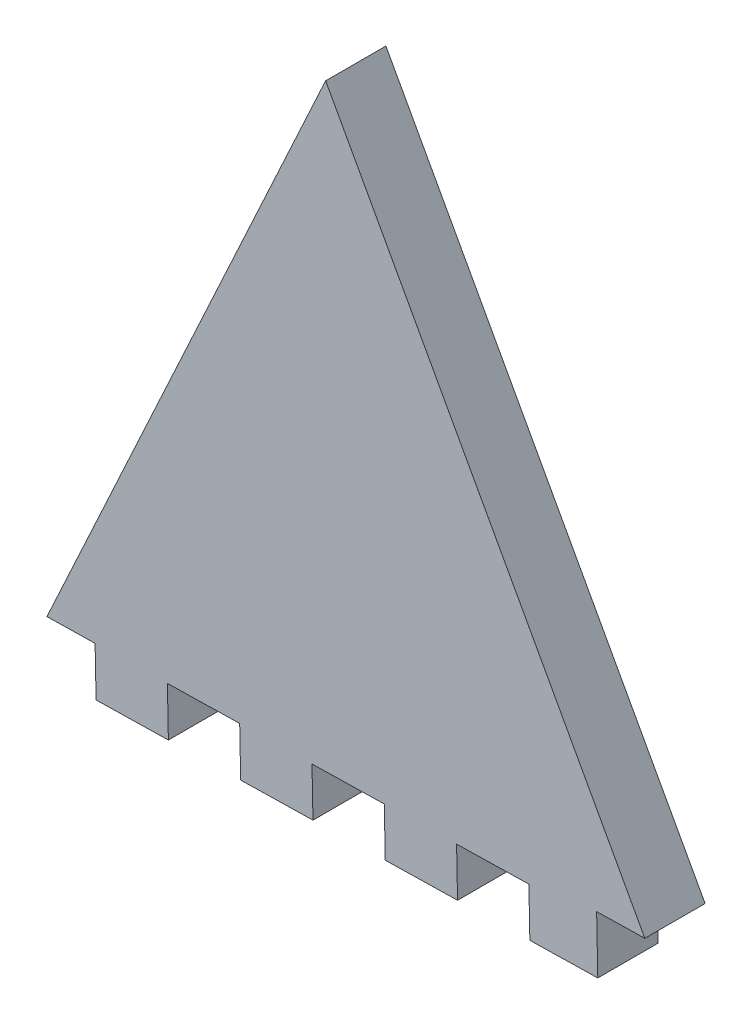
ISO-10303-21;
HEADER;
FILE_DESCRIPTION(('STEP AP214'),'2;1');
FILE_NAME('part.step','',(''),(''),'','','');
FILE_SCHEMA(('AUTOMOTIVE_DESIGN { 1 0 10303 214 1 1 1 1 }'));
ENDSEC;
DATA;
#1=APPLICATION_CONTEXT('core data for automotive mechanical design processes');
#2=APPLICATION_PROTOCOL_DEFINITION('international standard','automotive_design',2000,#1);
#3=PRODUCT_CONTEXT('',#1,'mechanical');
#4=PRODUCT('Part','Part','',(#3));
#5=PRODUCT_RELATED_PRODUCT_CATEGORY('part','',(#4));
#6=PRODUCT_DEFINITION_FORMATION('','',#4);
#7=PRODUCT_DEFINITION_CONTEXT('part definition',#1,'design');
#8=PRODUCT_DEFINITION('design','',#6,#7);
#9=PRODUCT_DEFINITION_SHAPE('','',#8);
#10=(LENGTH_UNIT() NAMED_UNIT(*) SI_UNIT(.MILLI.,.METRE.));
#11=(NAMED_UNIT(*) PLANE_ANGLE_UNIT() SI_UNIT($,.RADIAN.));
#12=(NAMED_UNIT(*) SI_UNIT($,.STERADIAN.) SOLID_ANGLE_UNIT());
#13=UNCERTAINTY_MEASURE_WITH_UNIT(LENGTH_MEASURE(1.E-05),#10,'distance_accuracy_value','');
#14=(GEOMETRIC_REPRESENTATION_CONTEXT(3) GLOBAL_UNCERTAINTY_ASSIGNED_CONTEXT((#13)) GLOBAL_UNIT_ASSIGNED_CONTEXT((#10,
#11,#12)) REPRESENTATION_CONTEXT('',''));
#15=CARTESIAN_POINT('',(0.,0.,0.));
#16=DIRECTION('',(0.,0.,1.));
#17=DIRECTION('',(1.,0.,0.));
#18=AXIS2_PLACEMENT_3D('',#15,#16,#17);
#19=CARTESIAN_POINT('',(-1.65337425308384,34.0261942117512,3.175));
#20=DIRECTION('',(-0.877154082787675,-0.480209032660687,0.));
#21=DIRECTION('',(0.480209032660687,-0.877154082787675,0.));
#22=AXIS2_PLACEMENT_3D('',#19,#20,#21);
#23=PLANE('',#22);
#24=DIRECTION('',(-0.480209032660687,0.877154082787675,0.));
#25=VECTOR('',#24,1.);
#26=CARTESIAN_POINT('',(-1.65337425308384,34.0261942117512,0.));
#27=LINE('',#26,#25);
#28=CARTESIAN_POINT('',(15.1647757924685,3.30601201181382,0.));
#29=VERTEX_POINT('',#28);
#30=CARTESIAN_POINT('',(-1.65337425308384,34.0261942117512,0.));
#31=VERTEX_POINT('',#30);
#32=EDGE_CURVE('E201',#29,#31,#27,.T.);
#33=ORIENTED_EDGE('',*,*,#32,.T.);
#34=DIRECTION('',(0.,0.,-1.));
#35=VECTOR('',#34,1.);
#36=CARTESIAN_POINT('',(-1.65337425308384,34.0261942117512,3.175));
#37=LINE('',#36,#35);
#38=CARTESIAN_POINT('',(-1.65337425308384,34.0261942117512,3.175));
#39=VERTEX_POINT('',#38);
#40=EDGE_CURVE('E11',#39,#31,#37,.T.);
#41=ORIENTED_EDGE('',*,*,#40,.F.);
#42=DIRECTION('',(-0.480209032660687,0.877154082787675,0.));
#43=VECTOR('',#42,1.);
#44=CARTESIAN_POINT('',(-1.65337425308384,34.0261942117512,3.175));
#45=LINE('',#44,#43);
#46=CARTESIAN_POINT('',(15.1647757924685,3.30601201181382,3.175));
#47=VERTEX_POINT('',#46);
#48=EDGE_CURVE('E237',#47,#39,#45,.T.);
#49=ORIENTED_EDGE('',*,*,#48,.F.);
#50=DIRECTION('',(0.,0.,-1.));
#51=VECTOR('',#50,1.);
#52=CARTESIAN_POINT('',(15.1647757924685,3.30601201181382,3.175));
#53=LINE('',#52,#51);
#54=EDGE_CURVE('E197',#47,#29,#53,.T.);
#55=ORIENTED_EDGE('',*,*,#54,.T.);
#56=EDGE_LOOP('',(#33,#41,#49,#55));
#57=FACE_BOUND('',#56,.T.);
#58=ADVANCED_FACE('F39',(#57),#23,.F.);
#59=CARTESIAN_POINT('',(-16.3405796230757,2.23207897368011,3.175));
#60=DIRECTION('',(0.907818118010795,-0.419364119365662,0.));
#61=DIRECTION('',(0.419364119365663,0.907818118010795,0.));
#62=AXIS2_PLACEMENT_3D('',#59,#60,#61);
#63=PLANE('',#62);
#64=DIRECTION('',(-0.419364119365663,-0.907818118010795,0.));
#65=VECTOR('',#64,1.);
#66=CARTESIAN_POINT('',(-16.3405796230757,2.23207897368011,0.));
#67=LINE('',#66,#65);
#68=CARTESIAN_POINT('',(-16.3405796230757,2.23207897368011,0.));
#69=VERTEX_POINT('',#68);
#70=EDGE_CURVE('E204',#31,#69,#67,.T.);
#71=ORIENTED_EDGE('',*,*,#70,.T.);
#72=DIRECTION('',(0.,0.,-1.));
#73=VECTOR('',#72,1.);
#74=CARTESIAN_POINT('',(-16.3405796230757,2.23207897368011,3.175));
#75=LINE('',#74,#73);
#76=CARTESIAN_POINT('',(-16.3405796230757,2.23207897368011,3.175));
#77=VERTEX_POINT('',#76);
#78=EDGE_CURVE('E47',#77,#69,#75,.T.);
#79=ORIENTED_EDGE('',*,*,#78,.F.);
#80=DIRECTION('',(-0.419364119365663,-0.907818118010795,0.));
#81=VECTOR('',#80,1.);
#82=CARTESIAN_POINT('',(-16.3405796230757,2.23207897368011,3.175));
#83=LINE('',#82,#81);
#84=EDGE_CURVE('E131',#39,#77,#83,.T.);
#85=ORIENTED_EDGE('',*,*,#84,.F.);
#86=ORIENTED_EDGE('',*,*,#40,.T.);
#87=EDGE_LOOP('',(#71,#79,#85,#86));
#88=FACE_BOUND('',#87,.T.);
#89=ADVANCED_FACE('F350',(#88),#63,.F.);
#90=CARTESIAN_POINT('',(-16.3405796230757,2.23207897368011,3.175));
#91=DIRECTION('',(-0.0201197654820474,0.999797577030945,0.));
#92=DIRECTION('',(-0.999797577030945,-0.0201197654820474,0.));
#93=AXIS2_PLACEMENT_3D('',#90,#91,#92);
#94=PLANE('',#93);
#95=DIRECTION('',(0.999797577030945,0.0201197654820474,0.));
#96=VECTOR('',#95,1.);
#97=CARTESIAN_POINT('',(-16.3405796230757,2.23207897368011,0.));
#98=LINE('',#97,#96);
#99=CARTESIAN_POINT('',(-13.8010937774171,2.28318317800451,0.));
#100=VERTEX_POINT('',#99);
#101=EDGE_CURVE('E206',#69,#100,#98,.T.);
#102=ORIENTED_EDGE('',*,*,#101,.T.);
#103=DIRECTION('',(0.,0.,-1.));
#104=VECTOR('',#103,1.);
#105=CARTESIAN_POINT('',(-13.8010937774171,2.28318317800451,3.175));
#106=LINE('',#105,#104);
#107=CARTESIAN_POINT('',(-13.8010937774171,2.28318317800451,3.175));
#108=VERTEX_POINT('',#107);
#109=EDGE_CURVE('E277',#108,#100,#106,.T.);
#110=ORIENTED_EDGE('',*,*,#109,.F.);
#111=DIRECTION('',(0.999797577030945,0.0201197654820474,0.));
#112=VECTOR('',#111,1.);
#113=CARTESIAN_POINT('',(-16.3405796230757,2.23207897368011,3.175));
#114=LINE('',#113,#112);
#115=EDGE_CURVE('E285',#77,#108,#114,.T.);
#116=ORIENTED_EDGE('',*,*,#115,.F.);
#117=ORIENTED_EDGE('',*,*,#78,.T.);
#118=EDGE_LOOP('',(#102,#110,#116,#117));
#119=FACE_BOUND('',#118,.T.);
#120=ADVANCED_FACE('F283',(#119),#94,.F.);
#121=CARTESIAN_POINT('',(-13.8010937774171,2.28318317800451,3.175));
#122=DIRECTION('',(0.999797577030945,0.0201197654820469,0.));
#123=DIRECTION('',(-0.0201197654820469,0.999797577030945,0.));
#124=AXIS2_PLACEMENT_3D('',#121,#122,#123);
#125=PLANE('',#124);
#126=DIRECTION('',(0.0201197654820469,-0.999797577030945,0.));
#127=VECTOR('',#126,1.);
#128=CARTESIAN_POINT('',(-13.8010937774171,2.28318317800451,0.));
#129=LINE('',#128,#127);
#130=CARTESIAN_POINT('',(-13.7495792147927,-0.27669431856394,0.));
#131=VERTEX_POINT('',#130);
#132=EDGE_CURVE('E208',#100,#131,#129,.T.);
#133=ORIENTED_EDGE('',*,*,#132,.T.);
#134=DIRECTION('',(0.,0.,-1.));
#135=VECTOR('',#134,1.);
#136=CARTESIAN_POINT('',(-13.7495792147927,-0.27669431856394,3.175));
#137=LINE('',#136,#135);
#138=CARTESIAN_POINT('',(-13.7495792147927,-0.27669431856394,3.175));
#139=VERTEX_POINT('',#138);
#140=EDGE_CURVE('E274',#139,#131,#137,.T.);
#141=ORIENTED_EDGE('',*,*,#140,.F.);
#142=DIRECTION('',(0.0201197654820469,-0.999797577030945,0.));
#143=VECTOR('',#142,1.);
#144=CARTESIAN_POINT('',(-13.8010937774171,2.28318317800451,3.175));
#145=LINE('',#144,#143);
#146=EDGE_CURVE('E303',#108,#139,#145,.T.);
#147=ORIENTED_EDGE('',*,*,#146,.F.);
#148=ORIENTED_EDGE('',*,*,#109,.T.);
#149=EDGE_LOOP('',(#133,#141,#147,#148));
#150=FACE_BOUND('',#149,.T.);
#151=ADVANCED_FACE('F294',(#150),#125,.F.);
#152=CARTESIAN_POINT('',(-13.7495792147927,-0.27669431856394,3.175));
#153=DIRECTION('',(-0.0201197654820469,0.999797577030945,0.));
#154=DIRECTION('',(-0.999797577030945,-0.0201197654820469,0.));
#155=AXIS2_PLACEMENT_3D('',#152,#153,#154);
#156=PLANE('',#155);
#157=DIRECTION('',(0.999797577030945,0.0201197654820469,0.));
#158=VECTOR('',#157,1.);
#159=CARTESIAN_POINT('',(-13.7495792147927,-0.27669431856394,0.));
#160=LINE('',#159,#158);
#161=CARTESIAN_POINT('',(-9.94035044630479,-0.200038012077341,0.));
#162=VERTEX_POINT('',#161);
#163=EDGE_CURVE('E210',#131,#162,#160,.T.);
#164=ORIENTED_EDGE('',*,*,#163,.T.);
#165=DIRECTION('',(0.,0.,-1.));
#166=VECTOR('',#165,1.);
#167=CARTESIAN_POINT('',(-9.94035044630479,-0.200038012077341,3.175));
#168=LINE('',#167,#166);
#169=CARTESIAN_POINT('',(-9.94035044630479,-0.200038012077341,3.175));
#170=VERTEX_POINT('',#169);
#171=EDGE_CURVE('E271',#170,#162,#168,.T.);
#172=ORIENTED_EDGE('',*,*,#171,.F.);
#173=DIRECTION('',(0.999797577030945,0.0201197654820469,0.));
#174=VECTOR('',#173,1.);
#175=CARTESIAN_POINT('',(-13.7495792147927,-0.27669431856394,3.175));
#176=LINE('',#175,#174);
#177=EDGE_CURVE('E300',#139,#170,#176,.T.);
#178=ORIENTED_EDGE('',*,*,#177,.F.);
#179=ORIENTED_EDGE('',*,*,#140,.T.);
#180=EDGE_LOOP('',(#164,#172,#178,#179));
#181=FACE_BOUND('',#180,.T.);
#182=ADVANCED_FACE('F298',(#181),#156,.F.);
#183=CARTESIAN_POINT('',(-9.94035044630479,-0.200038012077341,3.175));
#184=DIRECTION('',(-0.999797577030945,-0.0201197654820476,0.));
#185=DIRECTION('',(0.0201197654820476,-0.999797577030945,0.));
#186=AXIS2_PLACEMENT_3D('',#183,#184,#185);
#187=PLANE('',#186);
#188=DIRECTION('',(-0.0201197654820476,0.999797577030945,0.));
#189=VECTOR('',#188,1.);
#190=CARTESIAN_POINT('',(-9.94035044630479,-0.200038012077341,0.));
#191=LINE('',#190,#189);
#192=CARTESIAN_POINT('',(-9.99186500892923,2.3598394844911,0.));
#193=VERTEX_POINT('',#192);
#194=EDGE_CURVE('E212',#162,#193,#191,.T.);
#195=ORIENTED_EDGE('',*,*,#194,.T.);
#196=DIRECTION('',(0.,0.,-1.));
#197=VECTOR('',#196,1.);
#198=CARTESIAN_POINT('',(-9.99186500892923,2.3598394844911,3.175));
#199=LINE('',#198,#197);
#200=CARTESIAN_POINT('',(-9.99186500892923,2.3598394844911,3.175));
#201=VERTEX_POINT('',#200);
#202=EDGE_CURVE('E268',#201,#193,#199,.T.);
#203=ORIENTED_EDGE('',*,*,#202,.F.);
#204=DIRECTION('',(-0.0201197654820476,0.999797577030945,0.));
#205=VECTOR('',#204,1.);
#206=CARTESIAN_POINT('',(-9.94035044630479,-0.200038012077341,3.175));
#207=LINE('',#206,#205);
#208=EDGE_CURVE('E302',#170,#201,#207,.T.);
#209=ORIENTED_EDGE('',*,*,#208,.F.);
#210=ORIENTED_EDGE('',*,*,#171,.T.);
#211=EDGE_LOOP('',(#195,#203,#209,#210));
#212=FACE_BOUND('',#211,.T.);
#213=ADVANCED_FACE('F363',(#212),#187,.F.);
#214=CARTESIAN_POINT('',(-9.99186500892923,2.3598394844911,3.175));
#215=DIRECTION('',(-0.020119765482047,0.999797577030945,0.));
#216=DIRECTION('',(-0.999797577030945,-0.020119765482047,0.));
#217=AXIS2_PLACEMENT_3D('',#214,#215,#216);
#218=PLANE('',#217);
#219=DIRECTION('',(0.999797577030945,0.020119765482047,0.));
#220=VECTOR('',#219,1.);
#221=CARTESIAN_POINT('',(-9.99186500892923,2.3598394844911,0.));
#222=LINE('',#221,#220);
#223=CARTESIAN_POINT('',(-6.18263624044133,2.4364957909777,0.));
#224=VERTEX_POINT('',#223);
#225=EDGE_CURVE('E214',#193,#224,#222,.T.);
#226=ORIENTED_EDGE('',*,*,#225,.T.);
#227=DIRECTION('',(0.,0.,-1.));
#228=VECTOR('',#227,1.);
#229=CARTESIAN_POINT('',(-6.18263624044133,2.4364957909777,3.175));
#230=LINE('',#229,#228);
#231=CARTESIAN_POINT('',(-6.18263624044133,2.4364957909777,3.175));
#232=VERTEX_POINT('',#231);
#233=EDGE_CURVE('E265',#232,#224,#230,.T.);
#234=ORIENTED_EDGE('',*,*,#233,.F.);
#235=DIRECTION('',(0.999797577030945,0.020119765482047,0.));
#236=VECTOR('',#235,1.);
#237=CARTESIAN_POINT('',(-9.99186500892923,2.3598394844911,3.175));
#238=LINE('',#237,#236);
#239=EDGE_CURVE('E305',#201,#232,#238,.T.);
#240=ORIENTED_EDGE('',*,*,#239,.F.);
#241=ORIENTED_EDGE('',*,*,#202,.T.);
#242=EDGE_LOOP('',(#226,#234,#240,#241));
#243=FACE_BOUND('',#242,.T.);
#244=ADVANCED_FACE('F366',(#243),#218,.F.);
#245=CARTESIAN_POINT('',(-6.18263624044133,2.4364957909777,3.175));
#246=DIRECTION('',(0.999797577030945,0.0201197654820472,0.));
#247=DIRECTION('',(-0.0201197654820472,0.999797577030945,0.));
#248=AXIS2_PLACEMENT_3D('',#245,#246,#247);
#249=PLANE('',#248);
#250=DIRECTION('',(0.0201197654820472,-0.999797577030945,0.));
#251=VECTOR('',#250,1.);
#252=CARTESIAN_POINT('',(-6.18263624044133,2.4364957909777,0.));
#253=LINE('',#252,#251);
#254=CARTESIAN_POINT('',(-6.13112167781689,-0.123381705590757,0.));
#255=VERTEX_POINT('',#254);
#256=EDGE_CURVE('E216',#224,#255,#253,.T.);
#257=ORIENTED_EDGE('',*,*,#256,.T.);
#258=DIRECTION('',(0.,0.,-1.));
#259=VECTOR('',#258,1.);
#260=CARTESIAN_POINT('',(-6.13112167781689,-0.123381705590757,3.175));
#261=LINE('',#260,#259);
#262=CARTESIAN_POINT('',(-6.13112167781689,-0.123381705590757,3.175));
#263=VERTEX_POINT('',#262);
#264=EDGE_CURVE('E262',#263,#255,#261,.T.);
#265=ORIENTED_EDGE('',*,*,#264,.F.);
#266=DIRECTION('',(0.0201197654820472,-0.999797577030945,0.));
#267=VECTOR('',#266,1.);
#268=CARTESIAN_POINT('',(-6.18263624044133,2.4364957909777,3.175));
#269=LINE('',#268,#267);
#270=EDGE_CURVE('E311',#232,#263,#269,.T.);
#271=ORIENTED_EDGE('',*,*,#270,.F.);
#272=ORIENTED_EDGE('',*,*,#233,.T.);
#273=EDGE_LOOP('',(#257,#265,#271,#272));
#274=FACE_BOUND('',#273,.T.);
#275=ADVANCED_FACE('F370',(#274),#249,.F.);
#276=CARTESIAN_POINT('',(-6.13112167781689,-0.123381705590757,3.175));
#277=DIRECTION('',(-0.0201197654820468,0.999797577030945,0.));
#278=DIRECTION('',(-0.999797577030945,-0.0201197654820468,0.));
#279=AXIS2_PLACEMENT_3D('',#276,#277,#278);
#280=PLANE('',#279);
#281=DIRECTION('',(0.999797577030945,0.0201197654820468,0.));
#282=VECTOR('',#281,1.);
#283=CARTESIAN_POINT('',(-6.13112167781689,-0.123381705590757,0.));
#284=LINE('',#283,#282);
#285=CARTESIAN_POINT('',(-2.32189290932899,-0.0467253991041583,0.));
#286=VERTEX_POINT('',#285);
#287=EDGE_CURVE('E218',#255,#286,#284,.T.);
#288=ORIENTED_EDGE('',*,*,#287,.T.);
#289=DIRECTION('',(0.,0.,-1.));
#290=VECTOR('',#289,1.);
#291=CARTESIAN_POINT('',(-2.32189290932899,-0.0467253991041583,3.175));
#292=LINE('',#291,#290);
#293=CARTESIAN_POINT('',(-2.32189290932899,-0.0467253991041583,3.175));
#294=VERTEX_POINT('',#293);
#295=EDGE_CURVE('E259',#294,#286,#292,.T.);
#296=ORIENTED_EDGE('',*,*,#295,.F.);
#297=DIRECTION('',(0.999797577030945,0.0201197654820468,0.));
#298=VECTOR('',#297,1.);
#299=CARTESIAN_POINT('',(-6.13112167781689,-0.123381705590757,3.175));
#300=LINE('',#299,#298);
#301=EDGE_CURVE('E313',#263,#294,#300,.T.);
#302=ORIENTED_EDGE('',*,*,#301,.F.);
#303=ORIENTED_EDGE('',*,*,#264,.T.);
#304=EDGE_LOOP('',(#288,#296,#302,#303));
#305=FACE_BOUND('',#304,.T.);
#306=ADVANCED_FACE('F374',(#305),#280,.F.);
#307=CARTESIAN_POINT('',(-2.32189290932899,-0.0467253991041583,3.175));
#308=DIRECTION('',(-0.999797577030945,-0.0201197654820467,0.));
#309=DIRECTION('',(0.0201197654820467,-0.999797577030945,0.));
#310=AXIS2_PLACEMENT_3D('',#307,#308,#309);
#311=PLANE('',#310);
#312=DIRECTION('',(-0.0201197654820467,0.999797577030945,0.));
#313=VECTOR('',#312,1.);
#314=CARTESIAN_POINT('',(-2.32189290932899,-0.0467253991041583,0.));
#315=LINE('',#314,#313);
#316=CARTESIAN_POINT('',(-2.37299711365339,2.49276044655445,0.));
#317=VERTEX_POINT('',#316);
#318=EDGE_CURVE('E220',#286,#317,#315,.T.);
#319=ORIENTED_EDGE('',*,*,#318,.T.);
#320=DIRECTION('',(0.,0.,-1.));
#321=VECTOR('',#320,1.);
#322=CARTESIAN_POINT('',(-2.37299711365339,2.49276044655445,3.175));
#323=LINE('',#322,#321);
#324=CARTESIAN_POINT('',(-2.37299711365339,2.49276044655445,3.175));
#325=VERTEX_POINT('',#324);
#326=EDGE_CURVE('E256',#325,#317,#323,.T.);
#327=ORIENTED_EDGE('',*,*,#326,.F.);
#328=DIRECTION('',(-0.0201197654820467,0.999797577030945,0.));
#329=VECTOR('',#328,1.);
#330=CARTESIAN_POINT('',(-2.32189290932899,-0.0467253991041583,3.175));
#331=LINE('',#330,#329);
#332=EDGE_CURVE('E315',#294,#325,#331,.T.);
#333=ORIENTED_EDGE('',*,*,#332,.F.);
#334=ORIENTED_EDGE('',*,*,#295,.T.);
#335=EDGE_LOOP('',(#319,#327,#333,#334));
#336=FACE_BOUND('',#335,.T.);
#337=ADVANCED_FACE('F378',(#336),#311,.F.);
#338=CARTESIAN_POINT('',(-2.37299711365339,2.49276044655445,3.175));
#339=DIRECTION('',(-0.0201197654820467,0.999797577030945,0.));
#340=DIRECTION('',(-0.999797577030945,-0.0201197654820467,0.));
#341=AXIS2_PLACEMENT_3D('',#338,#339,#340);
#342=PLANE('',#341);
#343=DIRECTION('',(0.999797577030945,0.0201197654820467,0.));
#344=VECTOR('',#343,1.);
#345=CARTESIAN_POINT('',(-2.37299711365339,2.49276044655445,0.));
#346=LINE('',#345,#344);
#347=CARTESIAN_POINT('',(1.43623165483469,2.56941675304105,0.));
#348=VERTEX_POINT('',#347);
#349=EDGE_CURVE('E222',#317,#348,#346,.T.);
#350=ORIENTED_EDGE('',*,*,#349,.T.);
#351=DIRECTION('',(0.,0.,-1.));
#352=VECTOR('',#351,1.);
#353=CARTESIAN_POINT('',(1.43623165483469,2.56941675304105,3.175));
#354=LINE('',#353,#352);
#355=CARTESIAN_POINT('',(1.43623165483469,2.56941675304105,3.175));
#356=VERTEX_POINT('',#355);
#357=EDGE_CURVE('E253',#356,#348,#354,.T.);
#358=ORIENTED_EDGE('',*,*,#357,.F.);
#359=DIRECTION('',(0.999797577030945,0.0201197654820467,0.));
#360=VECTOR('',#359,1.);
#361=CARTESIAN_POINT('',(-2.37299711365339,2.49276044655445,3.175));
#362=LINE('',#361,#360);
#363=EDGE_CURVE('E317',#325,#356,#362,.T.);
#364=ORIENTED_EDGE('',*,*,#363,.F.);
#365=ORIENTED_EDGE('',*,*,#326,.T.);
#366=EDGE_LOOP('',(#350,#358,#364,#365));
#367=FACE_BOUND('',#366,.T.);
#368=ADVANCED_FACE('F382',(#367),#342,.F.);
#369=CARTESIAN_POINT('',(1.48733585915909,0.0299309073824584,3.175));
#370=DIRECTION('',(0.999797577030945,0.0201197654820467,0.));
#371=DIRECTION('',(-0.0201197654820467,0.999797577030945,0.));
#372=AXIS2_PLACEMENT_3D('',#369,#370,#371);
#373=PLANE('',#372);
#374=DIRECTION('',(0.0201197654820467,-0.999797577030945,0.));
#375=VECTOR('',#374,1.);
#376=CARTESIAN_POINT('',(1.48733585915909,0.0299309073824584,0.));
#377=LINE('',#376,#375);
#378=CARTESIAN_POINT('',(1.48733585915909,0.0299309073824584,0.));
#379=VERTEX_POINT('',#378);
#380=EDGE_CURVE('E224',#348,#379,#377,.T.);
#381=ORIENTED_EDGE('',*,*,#380,.T.);
#382=DIRECTION('',(0.,0.,-1.));
#383=VECTOR('',#382,1.);
#384=CARTESIAN_POINT('',(1.48733585915909,0.0299309073824584,3.175));
#385=LINE('',#384,#383);
#386=CARTESIAN_POINT('',(1.48733585915909,0.0299309073824584,3.175));
#387=VERTEX_POINT('',#386);
#388=EDGE_CURVE('E250',#387,#379,#385,.T.);
#389=ORIENTED_EDGE('',*,*,#388,.F.);
#390=DIRECTION('',(0.0201197654820467,-0.999797577030945,0.));
#391=VECTOR('',#390,1.);
#392=CARTESIAN_POINT('',(1.48733585915909,0.0299309073824584,3.175));
#393=LINE('',#392,#391);
#394=EDGE_CURVE('E319',#356,#387,#393,.T.);
#395=ORIENTED_EDGE('',*,*,#394,.F.);
#396=ORIENTED_EDGE('',*,*,#357,.T.);
#397=EDGE_LOOP('',(#381,#389,#395,#396));
#398=FACE_BOUND('',#397,.T.);
#399=ADVANCED_FACE('F386',(#398),#373,.F.);
#400=CARTESIAN_POINT('',(5.29656462764699,0.106587213869057,3.175));
#401=DIRECTION('',(-0.0201197654820468,0.999797577030945,0.));
#402=DIRECTION('',(-0.999797577030945,-0.0201197654820468,0.));
#403=AXIS2_PLACEMENT_3D('',#400,#401,#402);
#404=PLANE('',#403);
#405=DIRECTION('',(0.999797577030945,0.0201197654820468,0.));
#406=VECTOR('',#405,1.);
#407=CARTESIAN_POINT('',(5.29656462764699,0.106587213869057,0.));
#408=LINE('',#407,#406);
#409=CARTESIAN_POINT('',(5.29656462764699,0.106587213869057,0.));
#410=VERTEX_POINT('',#409);
#411=EDGE_CURVE('E226',#379,#410,#408,.T.);
#412=ORIENTED_EDGE('',*,*,#411,.T.);
#413=DIRECTION('',(0.,0.,-1.));
#414=VECTOR('',#413,1.);
#415=CARTESIAN_POINT('',(5.29656462764699,0.106587213869057,3.175));
#416=LINE('',#415,#414);
#417=CARTESIAN_POINT('',(5.29656462764699,0.106587213869057,3.175));
#418=VERTEX_POINT('',#417);
#419=EDGE_CURVE('E247',#418,#410,#416,.T.);
#420=ORIENTED_EDGE('',*,*,#419,.F.);
#421=DIRECTION('',(0.999797577030945,0.0201197654820468,0.));
#422=VECTOR('',#421,1.);
#423=CARTESIAN_POINT('',(5.29656462764699,0.106587213869057,3.175));
#424=LINE('',#423,#422);
#425=EDGE_CURVE('E321',#387,#418,#424,.T.);
#426=ORIENTED_EDGE('',*,*,#425,.F.);
#427=ORIENTED_EDGE('',*,*,#388,.T.);
#428=EDGE_LOOP('',(#412,#420,#426,#427));
#429=FACE_BOUND('',#428,.T.);
#430=ADVANCED_FACE('F390',(#429),#404,.F.);
#431=CARTESIAN_POINT('',(5.24546042332259,2.64607305952766,3.175));
#432=DIRECTION('',(-0.999797577030945,-0.0201197654820466,0.));
#433=DIRECTION('',(0.0201197654820466,-0.999797577030945,0.));
#434=AXIS2_PLACEMENT_3D('',#431,#432,#433);
#435=PLANE('',#434);
#436=DIRECTION('',(-0.0201197654820466,0.999797577030945,0.));
#437=VECTOR('',#436,1.);
#438=CARTESIAN_POINT('',(5.24546042332259,2.64607305952766,0.));
#439=LINE('',#438,#437);
#440=CARTESIAN_POINT('',(5.24546042332259,2.64607305952766,0.));
#441=VERTEX_POINT('',#440);
#442=EDGE_CURVE('E228',#410,#441,#439,.T.);
#443=ORIENTED_EDGE('',*,*,#442,.T.);
#444=DIRECTION('',(0.,0.,-1.));
#445=VECTOR('',#444,1.);
#446=CARTESIAN_POINT('',(5.24546042332259,2.64607305952766,3.175));
#447=LINE('',#446,#445);
#448=CARTESIAN_POINT('',(5.24546042332259,2.64607305952766,3.175));
#449=VERTEX_POINT('',#448);
#450=EDGE_CURVE('E244',#449,#441,#447,.T.);
#451=ORIENTED_EDGE('',*,*,#450,.F.);
#452=DIRECTION('',(-0.0201197654820466,0.999797577030945,0.));
#453=VECTOR('',#452,1.);
#454=CARTESIAN_POINT('',(5.24546042332259,2.64607305952766,3.175));
#455=LINE('',#454,#453);
#456=EDGE_CURVE('E323',#418,#449,#455,.T.);
#457=ORIENTED_EDGE('',*,*,#456,.F.);
#458=ORIENTED_EDGE('',*,*,#419,.T.);
#459=EDGE_LOOP('',(#443,#451,#457,#458));
#460=FACE_BOUND('',#459,.T.);
#461=ADVANCED_FACE('F394',(#460),#435,.F.);
#462=CARTESIAN_POINT('',(9.05468919181049,2.72272936601425,3.175));
#463=DIRECTION('',(-0.0201197654820468,0.999797577030945,0.));
#464=DIRECTION('',(-0.999797577030945,-0.0201197654820468,0.));
#465=AXIS2_PLACEMENT_3D('',#462,#463,#464);
#466=PLANE('',#465);
#467=DIRECTION('',(0.999797577030945,0.0201197654820468,0.));
#468=VECTOR('',#467,1.);
#469=CARTESIAN_POINT('',(9.05468919181049,2.72272936601425,0.));
#470=LINE('',#469,#468);
#471=CARTESIAN_POINT('',(9.05468919181049,2.72272936601425,0.));
#472=VERTEX_POINT('',#471);
#473=EDGE_CURVE('E230',#441,#472,#470,.T.);
#474=ORIENTED_EDGE('',*,*,#473,.T.);
#475=DIRECTION('',(0.,0.,-1.));
#476=VECTOR('',#475,1.);
#477=CARTESIAN_POINT('',(9.05468919181049,2.72272936601425,3.175));
#478=LINE('',#477,#476);
#479=CARTESIAN_POINT('',(9.05468919181049,2.72272936601425,3.175));
#480=VERTEX_POINT('',#479);
#481=EDGE_CURVE('E241',#480,#472,#478,.T.);
#482=ORIENTED_EDGE('',*,*,#481,.F.);
#483=DIRECTION('',(0.999797577030945,0.0201197654820468,0.));
#484=VECTOR('',#483,1.);
#485=CARTESIAN_POINT('',(9.05468919181049,2.72272936601425,3.175));
#486=LINE('',#485,#484);
#487=EDGE_CURVE('E325',#449,#480,#486,.T.);
#488=ORIENTED_EDGE('',*,*,#487,.F.);
#489=ORIENTED_EDGE('',*,*,#450,.T.);
#490=EDGE_LOOP('',(#474,#482,#488,#489));
#491=FACE_BOUND('',#490,.T.);
#492=ADVANCED_FACE('F331',(#491),#466,.F.);
#493=CARTESIAN_POINT('',(9.10579339613489,0.183243520355654,3.175));
#494=DIRECTION('',(0.999797577030945,0.0201197654820469,0.));
#495=DIRECTION('',(-0.0201197654820469,0.999797577030945,0.));
#496=AXIS2_PLACEMENT_3D('',#493,#494,#495);
#497=PLANE('',#496);
#498=DIRECTION('',(0.0201197654820469,-0.999797577030945,0.));
#499=VECTOR('',#498,1.);
#500=CARTESIAN_POINT('',(9.10579339613489,0.183243520355654,0.));
#501=LINE('',#500,#499);
#502=CARTESIAN_POINT('',(9.10579339613489,0.183243520355654,0.));
#503=VERTEX_POINT('',#502);
#504=EDGE_CURVE('E232',#472,#503,#501,.T.);
#505=ORIENTED_EDGE('',*,*,#504,.T.);
#506=DIRECTION('',(0.,0.,-1.));
#507=VECTOR('',#506,1.);
#508=CARTESIAN_POINT('',(9.10579339613489,0.183243520355654,3.175));
#509=LINE('',#508,#507);
#510=CARTESIAN_POINT('',(9.10579339613489,0.183243520355654,3.175));
#511=VERTEX_POINT('',#510);
#512=EDGE_CURVE('E192',#511,#503,#509,.T.);
#513=ORIENTED_EDGE('',*,*,#512,.F.);
#514=DIRECTION('',(0.0201197654820469,-0.999797577030945,0.));
#515=VECTOR('',#514,1.);
#516=CARTESIAN_POINT('',(9.10579339613489,0.183243520355654,3.175));
#517=LINE('',#516,#515);
#518=EDGE_CURVE('E183',#480,#511,#517,.T.);
#519=ORIENTED_EDGE('',*,*,#518,.F.);
#520=ORIENTED_EDGE('',*,*,#481,.T.);
#521=EDGE_LOOP('',(#505,#513,#519,#520));
#522=FACE_BOUND('',#521,.T.);
#523=ADVANCED_FACE('F335',(#522),#497,.F.);
#524=CARTESIAN_POINT('',(12.6856538922602,0.255284056655392,3.175));
#525=DIRECTION('',(-0.0201197654820479,0.999797577030945,0.));
#526=DIRECTION('',(-0.999797577030945,-0.0201197654820479,0.));
#527=AXIS2_PLACEMENT_3D('',#524,#525,#526);
#528=PLANE('',#527);
#529=DIRECTION('',(0.999797577030945,0.0201197654820479,0.));
#530=VECTOR('',#529,1.);
#531=CARTESIAN_POINT('',(12.6856538922602,0.255284056655392,0.));
#532=LINE('',#531,#530);
#533=CARTESIAN_POINT('',(12.6856538922602,0.255284056655392,0.));
#534=VERTEX_POINT('',#533);
#535=EDGE_CURVE('E191',#503,#534,#532,.T.);
#536=ORIENTED_EDGE('',*,*,#535,.T.);
#537=DIRECTION('',(0.,0.,-1.));
#538=VECTOR('',#537,1.);
#539=CARTESIAN_POINT('',(12.6856538922602,0.255284056655392,3.175));
#540=LINE('',#539,#538);
#541=CARTESIAN_POINT('',(12.6856538922602,0.255284056655392,3.175));
#542=VERTEX_POINT('',#541);
#543=EDGE_CURVE('E188',#542,#534,#540,.T.);
#544=ORIENTED_EDGE('',*,*,#543,.F.);
#545=DIRECTION('',(0.999797577030945,0.0201197654820479,0.));
#546=VECTOR('',#545,1.);
#547=CARTESIAN_POINT('',(12.6856538922602,0.255284056655392,3.175));
#548=LINE('',#547,#546);
#549=EDGE_CURVE('E177',#511,#542,#548,.T.);
#550=ORIENTED_EDGE('',*,*,#549,.F.);
#551=ORIENTED_EDGE('',*,*,#512,.T.);
#552=EDGE_LOOP('',(#536,#544,#550,#551));
#553=FACE_BOUND('',#552,.T.);
#554=ADVANCED_FACE('F189',(#553),#528,.F.);
#555=CARTESIAN_POINT('',(12.6252899468099,3.25490780748943,3.175));
#556=DIRECTION('',(-0.999797577030944,-0.0201197654820469,0.));
#557=DIRECTION('',(0.0201197654820469,-0.999797577030945,0.));
#558=AXIS2_PLACEMENT_3D('',#555,#556,#557);
#559=PLANE('',#558);
#560=DIRECTION('',(-0.0201197654820469,0.999797577030944,0.));
#561=VECTOR('',#560,1.);
#562=CARTESIAN_POINT('',(12.6252899468099,3.25490780748943,0.));
#563=LINE('',#562,#561);
#564=CARTESIAN_POINT('',(12.6252899468099,3.25490780748943,0.));
#565=VERTEX_POINT('',#564);
#566=EDGE_CURVE('E117',#534,#565,#563,.T.);
#567=ORIENTED_EDGE('',*,*,#566,.T.);
#568=DIRECTION('',(0.,0.,-1.));
#569=VECTOR('',#568,1.);
#570=CARTESIAN_POINT('',(12.6252899468099,3.25490780748943,3.175));
#571=LINE('',#570,#569);
#572=CARTESIAN_POINT('',(12.6252899468099,3.25490780748943,3.175));
#573=VERTEX_POINT('',#572);
#574=EDGE_CURVE('E193',#573,#565,#571,.T.);
#575=ORIENTED_EDGE('',*,*,#574,.F.);
#576=DIRECTION('',(-0.0201197654820469,0.999797577030944,0.));
#577=VECTOR('',#576,1.);
#578=CARTESIAN_POINT('',(12.6252899468099,3.25490780748943,3.175));
#579=LINE('',#578,#577);
#580=EDGE_CURVE('E181',#542,#573,#579,.T.);
#581=ORIENTED_EDGE('',*,*,#580,.F.);
#582=ORIENTED_EDGE('',*,*,#543,.T.);
#583=EDGE_LOOP('',(#567,#575,#581,#582));
#584=FACE_BOUND('',#583,.T.);
#585=ADVANCED_FACE('F195',(#584),#559,.F.);
#586=CARTESIAN_POINT('',(15.1647757924685,3.30601201181382,3.175));
#587=DIRECTION('',(-0.0201197654820469,0.999797577030945,0.));
#588=DIRECTION('',(-0.999797577030945,-0.0201197654820469,0.));
#589=AXIS2_PLACEMENT_3D('',#586,#587,#588);
#590=PLANE('',#589);
#591=DIRECTION('',(0.999797577030945,0.0201197654820469,0.));
#592=VECTOR('',#591,1.);
#593=CARTESIAN_POINT('',(15.1647757924685,3.30601201181382,0.));
#594=LINE('',#593,#592);
#595=EDGE_CURVE('E123',#565,#29,#594,.T.);
#596=ORIENTED_EDGE('',*,*,#595,.T.);
#597=ORIENTED_EDGE('',*,*,#54,.F.);
#598=DIRECTION('',(0.999797577030945,0.0201197654820469,0.));
#599=VECTOR('',#598,1.);
#600=CARTESIAN_POINT('',(15.1647757924685,3.30601201181382,3.175));
#601=LINE('',#600,#599);
#602=EDGE_CURVE('E55',#573,#47,#601,.T.);
#603=ORIENTED_EDGE('',*,*,#602,.F.);
#604=ORIENTED_EDGE('',*,*,#574,.T.);
#605=EDGE_LOOP('',(#596,#597,#603,#604));
#606=FACE_BOUND('',#605,.T.);
#607=ADVANCED_FACE('F339',(#606),#590,.F.);
#608=CARTESIAN_POINT('',(0.,0.,3.175));
#609=DIRECTION('',(0.,0.,-1.));
#610=DIRECTION('',(-1.,0.,0.));
#611=AXIS2_PLACEMENT_3D('',#608,#609,#610);
#612=PLANE('',#611);
#613=ORIENTED_EDGE('',*,*,#48,.T.);
#614=ORIENTED_EDGE('',*,*,#84,.T.);
#615=ORIENTED_EDGE('',*,*,#115,.T.);
#616=ORIENTED_EDGE('',*,*,#146,.T.);
#617=ORIENTED_EDGE('',*,*,#177,.T.);
#618=ORIENTED_EDGE('',*,*,#208,.T.);
#619=ORIENTED_EDGE('',*,*,#239,.T.);
#620=ORIENTED_EDGE('',*,*,#270,.T.);
#621=ORIENTED_EDGE('',*,*,#301,.T.);
#622=ORIENTED_EDGE('',*,*,#332,.T.);
#623=ORIENTED_EDGE('',*,*,#363,.T.);
#624=ORIENTED_EDGE('',*,*,#394,.T.);
#625=ORIENTED_EDGE('',*,*,#425,.T.);
#626=ORIENTED_EDGE('',*,*,#456,.T.);
#627=ORIENTED_EDGE('',*,*,#487,.T.);
#628=ORIENTED_EDGE('',*,*,#518,.T.);
#629=ORIENTED_EDGE('',*,*,#549,.T.);
#630=ORIENTED_EDGE('',*,*,#580,.T.);
#631=ORIENTED_EDGE('',*,*,#602,.T.);
#632=EDGE_LOOP('',(#613,#614,#615,#616,#617,#618,#619,#620,#621,#622,#623,#624,#625,#626,#627,
#628,#629,#630,#631));
#633=FACE_BOUND('',#632,.T.);
#634=ADVANCED_FACE('F179',(#633),#612,.F.);
#635=CARTESIAN_POINT('',(0.,0.,0.));
#636=DIRECTION('',(0.,0.,-1.));
#637=DIRECTION('',(-1.,0.,0.));
#638=AXIS2_PLACEMENT_3D('',#635,#636,#637);
#639=PLANE('',#638);
#640=ORIENTED_EDGE('',*,*,#32,.F.);
#641=ORIENTED_EDGE('',*,*,#595,.F.);
#642=ORIENTED_EDGE('',*,*,#566,.F.);
#643=ORIENTED_EDGE('',*,*,#535,.F.);
#644=ORIENTED_EDGE('',*,*,#504,.F.);
#645=ORIENTED_EDGE('',*,*,#473,.F.);
#646=ORIENTED_EDGE('',*,*,#442,.F.);
#647=ORIENTED_EDGE('',*,*,#411,.F.);
#648=ORIENTED_EDGE('',*,*,#380,.F.);
#649=ORIENTED_EDGE('',*,*,#349,.F.);
#650=ORIENTED_EDGE('',*,*,#318,.F.);
#651=ORIENTED_EDGE('',*,*,#287,.F.);
#652=ORIENTED_EDGE('',*,*,#256,.F.);
#653=ORIENTED_EDGE('',*,*,#225,.F.);
#654=ORIENTED_EDGE('',*,*,#194,.F.);
#655=ORIENTED_EDGE('',*,*,#163,.F.);
#656=ORIENTED_EDGE('',*,*,#132,.F.);
#657=ORIENTED_EDGE('',*,*,#101,.F.);
#658=ORIENTED_EDGE('',*,*,#70,.F.);
#659=EDGE_LOOP('',(#640,#641,#642,#643,#644,#645,#646,#647,#648,#649,#650,#651,#652,#653,#654,
#655,#656,#657,#658));
#660=FACE_BOUND('',#659,.T.);
#661=ADVANCED_FACE('F289',(#660),#639,.T.);
#662=CLOSED_SHELL('',(#58,#89,#120,#151,#182,#213,#244,#275,#306,#337,#368,#399,#430,#461,#492,
#523,#554,#585,#607,#634,#661));
#663=MANIFOLD_SOLID_BREP('B2',#662);
#664=ADVANCED_BREP_SHAPE_REPRESENTATION('',(#18,#663),#14);
#665=SHAPE_DEFINITION_REPRESENTATION(#9,#664);
ENDSEC;
END-ISO-10303-21;
